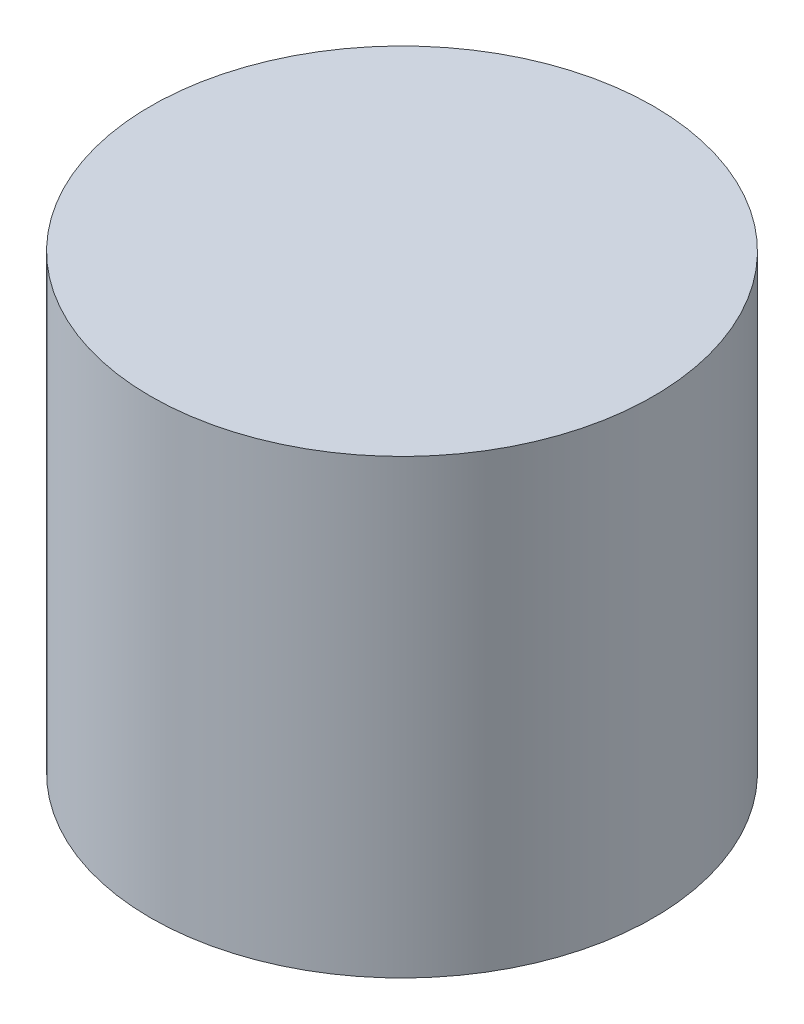
ISO-10303-21;
HEADER;
FILE_DESCRIPTION(('STEP AP214'),'2;1');
FILE_NAME('part.step','',(''),(''),'','','');
FILE_SCHEMA(('AUTOMOTIVE_DESIGN { 1 0 10303 214 1 1 1 1 }'));
ENDSEC;
DATA;
#1=APPLICATION_CONTEXT('core data for automotive mechanical design processes');
#2=APPLICATION_PROTOCOL_DEFINITION('international standard','automotive_design',2000,#1);
#3=PRODUCT_CONTEXT('',#1,'mechanical');
#4=PRODUCT('Part','Part','',(#3));
#5=PRODUCT_RELATED_PRODUCT_CATEGORY('part','',(#4));
#6=PRODUCT_DEFINITION_FORMATION('','',#4);
#7=PRODUCT_DEFINITION_CONTEXT('part definition',#1,'design');
#8=PRODUCT_DEFINITION('design','',#6,#7);
#9=PRODUCT_DEFINITION_SHAPE('','',#8);
#10=(LENGTH_UNIT() NAMED_UNIT(*) SI_UNIT(.MILLI.,.METRE.));
#11=(NAMED_UNIT(*) PLANE_ANGLE_UNIT() SI_UNIT($,.RADIAN.));
#12=(NAMED_UNIT(*) SI_UNIT($,.STERADIAN.) SOLID_ANGLE_UNIT());
#13=UNCERTAINTY_MEASURE_WITH_UNIT(LENGTH_MEASURE(1.E-05),#10,'distance_accuracy_value','');
#14=(GEOMETRIC_REPRESENTATION_CONTEXT(3) GLOBAL_UNCERTAINTY_ASSIGNED_CONTEXT((#13)) GLOBAL_UNIT_ASSIGNED_CONTEXT((#10,
#11,#12)) REPRESENTATION_CONTEXT('',''));
#15=CARTESIAN_POINT('',(0.,0.,0.));
#16=DIRECTION('',(0.,0.,1.));
#17=DIRECTION('',(1.,0.,0.));
#18=AXIS2_PLACEMENT_3D('',#15,#16,#17);
#19=CARTESIAN_POINT('',(0.,10.,0.));
#20=DIRECTION('',(0.,-1.,0.));
#21=DIRECTION('',(0.,0.,-1.));
#22=AXIS2_PLACEMENT_3D('',#19,#20,#21);
#23=CYLINDRICAL_SURFACE('',#22,5.565);
#24=CARTESIAN_POINT('',(0.,10.,0.));
#25=DIRECTION('',(0.,1.,0.));
#26=DIRECTION('',(0.,0.,1.));
#27=AXIS2_PLACEMENT_3D('',#24,#25,#26);
#28=CIRCLE('',#27,5.565);
#29=CARTESIAN_POINT('',(0.,10.,5.565));
#30=VERTEX_POINT('',#29);
#31=EDGE_CURVE('E10',#30,#30,#28,.T.);
#32=ORIENTED_EDGE('',*,*,#31,.F.);
#33=EDGE_LOOP('',(#32));
#34=FACE_BOUND('',#33,.T.);
#35=CARTESIAN_POINT('',(0.,0.,0.));
#36=DIRECTION('',(0.,1.,0.));
#37=DIRECTION('',(0.,0.,1.));
#38=AXIS2_PLACEMENT_3D('',#35,#36,#37);
#39=CIRCLE('',#38,5.565);
#40=CARTESIAN_POINT('',(0.,0.,5.565));
#41=VERTEX_POINT('',#40);
#42=EDGE_CURVE('E46',#41,#41,#39,.T.);
#43=ORIENTED_EDGE('',*,*,#42,.T.);
#44=EDGE_LOOP('',(#43));
#45=FACE_BOUND('',#44,.T.);
#46=ADVANCED_FACE('F43',(#34,#45),#23,.T.);
#47=CARTESIAN_POINT('',(0.,10.,0.));
#48=DIRECTION('',(0.,1.,0.));
#49=DIRECTION('',(0.,0.,1.));
#50=AXIS2_PLACEMENT_3D('',#47,#48,#49);
#51=PLANE('',#50);
#52=ORIENTED_EDGE('',*,*,#31,.T.);
#53=EDGE_LOOP('',(#52));
#54=FACE_BOUND('',#53,.T.);
#55=ADVANCED_FACE('F58',(#54),#51,.T.);
#56=CARTESIAN_POINT('',(0.,0.,0.));
#57=DIRECTION('',(0.,1.,0.));
#58=DIRECTION('',(0.,0.,1.));
#59=AXIS2_PLACEMENT_3D('',#56,#57,#58);
#60=PLANE('',#59);
#61=ORIENTED_EDGE('',*,*,#42,.F.);
#62=EDGE_LOOP('',(#61));
#63=FACE_BOUND('',#62,.T.);
#64=ADVANCED_FACE('F56',(#63),#60,.F.);
#65=CLOSED_SHELL('',(#46,#55,#64));
#66=MANIFOLD_SOLID_BREP('B2',#65);
#67=ADVANCED_BREP_SHAPE_REPRESENTATION('',(#18,#66),#14);
#68=SHAPE_DEFINITION_REPRESENTATION(#9,#67);
ENDSEC;
END-ISO-10303-21;
